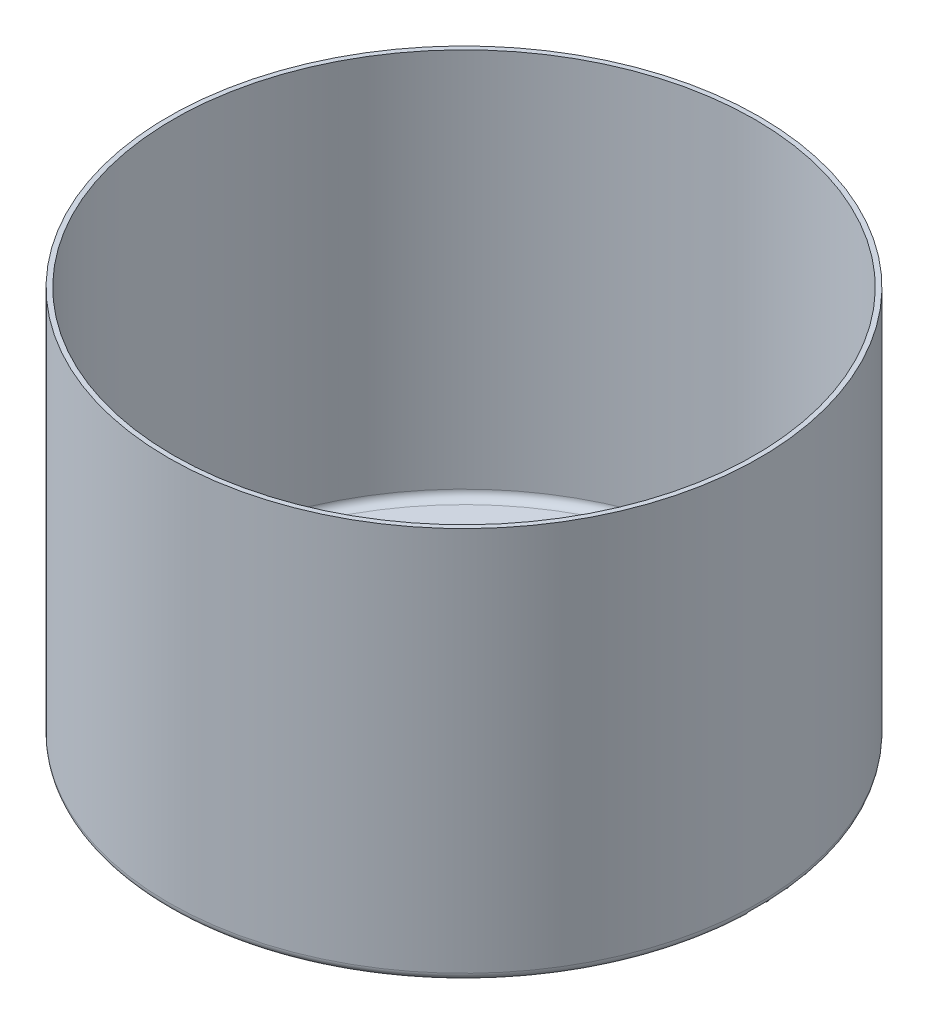
ISO-10303-21;
HEADER;
FILE_DESCRIPTION(('STEP AP214'),'2;1');
FILE_NAME('part.step','',(''),(''),'','','');
FILE_SCHEMA(('AUTOMOTIVE_DESIGN { 1 0 10303 214 1 1 1 1 }'));
ENDSEC;
DATA;
#1=APPLICATION_CONTEXT('core data for automotive mechanical design processes');
#2=APPLICATION_PROTOCOL_DEFINITION('international standard','automotive_design',2000,#1);
#3=PRODUCT_CONTEXT('',#1,'mechanical');
#4=PRODUCT('Part','Part','',(#3));
#5=PRODUCT_RELATED_PRODUCT_CATEGORY('part','',(#4));
#6=PRODUCT_DEFINITION_FORMATION('','',#4);
#7=PRODUCT_DEFINITION_CONTEXT('part definition',#1,'design');
#8=PRODUCT_DEFINITION('design','',#6,#7);
#9=PRODUCT_DEFINITION_SHAPE('','',#8);
#10=(LENGTH_UNIT() NAMED_UNIT(*) SI_UNIT(.MILLI.,.METRE.));
#11=(NAMED_UNIT(*) PLANE_ANGLE_UNIT() SI_UNIT($,.RADIAN.));
#12=(NAMED_UNIT(*) SI_UNIT($,.STERADIAN.) SOLID_ANGLE_UNIT());
#13=UNCERTAINTY_MEASURE_WITH_UNIT(LENGTH_MEASURE(1.E-05),#10,'distance_accuracy_value','');
#14=(GEOMETRIC_REPRESENTATION_CONTEXT(3) GLOBAL_UNCERTAINTY_ASSIGNED_CONTEXT((#13)) GLOBAL_UNIT_ASSIGNED_CONTEXT((#10,
#11,#12)) REPRESENTATION_CONTEXT('',''));
#15=CARTESIAN_POINT('',(0.,0.,0.));
#16=DIRECTION('',(0.,0.,1.));
#17=DIRECTION('',(1.,0.,0.));
#18=AXIS2_PLACEMENT_3D('',#15,#16,#17);
#19=CARTESIAN_POINT('',(93.98,-78.476,0.));
#20=DIRECTION('',(0.,1.,0.));
#21=DIRECTION('',(0.,0.,1.));
#22=AXIS2_PLACEMENT_3D('',#19,#20,#21);
#23=PLANE('',#22);
#24=CARTESIAN_POINT('',(0.,-78.476,0.));
#25=DIRECTION('',(0.,1.,0.));
#26=DIRECTION('',(0.,0.,1.));
#27=AXIS2_PLACEMENT_3D('',#24,#25,#26);
#28=CIRCLE('',#27,91.44);
#29=CARTESIAN_POINT('',(0.,-78.476,91.44));
#30=VERTEX_POINT('',#29);
#31=EDGE_CURVE('E48',#30,#30,#28,.T.);
#32=ORIENTED_EDGE('',*,*,#31,.T.);
#33=EDGE_LOOP('',(#32));
#34=FACE_BOUND('',#33,.T.);
#35=CARTESIAN_POINT('',(-63.5,-78.476,0.));
#36=DIRECTION('',(0.,1.,0.));
#37=DIRECTION('',(0.,0.,1.));
#38=AXIS2_PLACEMENT_3D('',#35,#36,#37);
#39=CIRCLE('',#38,3.25);
#40=CARTESIAN_POINT('',(-63.5,-78.476,3.25));
#41=VERTEX_POINT('',#40);
#42=EDGE_CURVE('E85',#41,#41,#39,.F.);
#43=ORIENTED_EDGE('',*,*,#42,.T.);
#44=EDGE_LOOP('',(#43));
#45=FACE_BOUND('',#44,.T.);
#46=CARTESIAN_POINT('',(0.,-78.476,-63.5));
#47=DIRECTION('',(0.,1.,0.));
#48=DIRECTION('',(0.,0.,1.));
#49=AXIS2_PLACEMENT_3D('',#46,#47,#48);
#50=CIRCLE('',#49,3.25);
#51=CARTESIAN_POINT('',(0.,-78.476,-60.25));
#52=VERTEX_POINT('',#51);
#53=EDGE_CURVE('E74',#52,#52,#50,.F.);
#54=ORIENTED_EDGE('',*,*,#53,.T.);
#55=EDGE_LOOP('',(#54));
#56=FACE_BOUND('',#55,.T.);
#57=CARTESIAN_POINT('',(63.5,-78.476,0.));
#58=DIRECTION('',(0.,1.,0.));
#59=DIRECTION('',(0.,0.,1.));
#60=AXIS2_PLACEMENT_3D('',#57,#58,#59);
#61=CIRCLE('',#60,3.25000000000001);
#62=CARTESIAN_POINT('',(63.5,-78.476,3.25000000000001));
#63=VERTEX_POINT('',#62);
#64=EDGE_CURVE('E73',#63,#63,#61,.F.);
#65=ORIENTED_EDGE('',*,*,#64,.T.);
#66=EDGE_LOOP('',(#65));
#67=FACE_BOUND('',#66,.T.);
#68=CARTESIAN_POINT('',(0.,-78.476,63.5));
#69=DIRECTION('',(0.,1.,0.));
#70=DIRECTION('',(0.,0.,1.));
#71=AXIS2_PLACEMENT_3D('',#68,#69,#70);
#72=CIRCLE('',#71,3.25);
#73=CARTESIAN_POINT('',(0.,-78.476,66.75));
#74=VERTEX_POINT('',#73);
#75=EDGE_CURVE('E67',#74,#74,#72,.F.);
#76=ORIENTED_EDGE('',*,*,#75,.T.);
#77=EDGE_LOOP('',(#76));
#78=FACE_BOUND('',#77,.T.);
#79=CARTESIAN_POINT('',(0.,-78.476,0.));
#80=DIRECTION('',(0.,1.,0.));
#81=DIRECTION('',(0.,0.,1.));
#82=AXIS2_PLACEMENT_3D('',#79,#80,#81);
#83=CIRCLE('',#82,18.415);
#84=CARTESIAN_POINT('',(0.,-78.476,18.415));
#85=VERTEX_POINT('',#84);
#86=EDGE_CURVE('E64',#85,#85,#83,.F.);
#87=ORIENTED_EDGE('',*,*,#86,.T.);
#88=EDGE_LOOP('',(#87));
#89=FACE_BOUND('',#88,.T.);
#90=ADVANCED_FACE('F37',(#34,#45,#56,#67,#78,#89),#23,.T.);
#91=CARTESIAN_POINT('',(0.,0.,0.));
#92=DIRECTION('',(0.,-1.,0.));
#93=DIRECTION('',(0.,0.,-1.));
#94=AXIS2_PLACEMENT_3D('',#91,#92,#93);
#95=CYLINDRICAL_SURFACE('',#94,95.504);
#96=CARTESIAN_POINT('',(0.,-77.46,0.));
#97=DIRECTION('',(0.,-1.,0.));
#98=DIRECTION('',(0.,0.,-1.));
#99=AXIS2_PLACEMENT_3D('',#96,#97,#98);
#100=CIRCLE('',#99,95.504);
#101=CARTESIAN_POINT('',(0.,-77.46,-95.504));
#102=VERTEX_POINT('',#101);
#103=EDGE_CURVE('E10',#102,#102,#100,.F.);
#104=ORIENTED_EDGE('',*,*,#103,.T.);
#105=EDGE_LOOP('',(#104));
#106=FACE_BOUND('',#105,.T.);
#107=CARTESIAN_POINT('',(0.,47.,0.));
#108=DIRECTION('',(0.,-1.,0.));
#109=DIRECTION('',(0.,0.,-1.));
#110=AXIS2_PLACEMENT_3D('',#107,#108,#109);
#111=CIRCLE('',#110,95.504);
#112=CARTESIAN_POINT('',(0.,47.,-95.504));
#113=VERTEX_POINT('',#112);
#114=EDGE_CURVE('E60',#113,#113,#111,.T.);
#115=ORIENTED_EDGE('',*,*,#114,.T.);
#116=EDGE_LOOP('',(#115));
#117=FACE_BOUND('',#116,.T.);
#118=ADVANCED_FACE('F108',(#106,#117),#95,.T.);
#119=CARTESIAN_POINT('',(95.504,-80.,0.));
#120=DIRECTION('',(0.,-1.,0.));
#121=DIRECTION('',(0.,0.,-1.));
#122=AXIS2_PLACEMENT_3D('',#119,#120,#121);
#123=PLANE('',#122);
#124=CARTESIAN_POINT('',(0.,-80.,0.));
#125=DIRECTION('',(0.,-1.,0.));
#126=DIRECTION('',(0.,0.,-1.));
#127=AXIS2_PLACEMENT_3D('',#124,#125,#126);
#128=CIRCLE('',#127,92.964);
#129=CARTESIAN_POINT('',(0.,-80.,-92.964));
#130=VERTEX_POINT('',#129);
#131=EDGE_CURVE('E44',#130,#130,#128,.T.);
#132=ORIENTED_EDGE('',*,*,#131,.T.);
#133=EDGE_LOOP('',(#132));
#134=FACE_BOUND('',#133,.T.);
#135=CARTESIAN_POINT('',(0.,-80.,63.5));
#136=DIRECTION('',(0.,-1.,0.));
#137=DIRECTION('',(0.,0.,-1.));
#138=AXIS2_PLACEMENT_3D('',#135,#136,#137);
#139=CIRCLE('',#138,3.25);
#140=CARTESIAN_POINT('',(0.,-80.,60.25));
#141=VERTEX_POINT('',#140);
#142=EDGE_CURVE('E77',#141,#141,#139,.T.);
#143=ORIENTED_EDGE('',*,*,#142,.F.);
#144=EDGE_LOOP('',(#143));
#145=FACE_BOUND('',#144,.T.);
#146=CARTESIAN_POINT('',(63.5,-80.,0.));
#147=DIRECTION('',(0.,-1.,0.));
#148=DIRECTION('',(0.,0.,-1.));
#149=AXIS2_PLACEMENT_3D('',#146,#147,#148);
#150=CIRCLE('',#149,3.25000000000001);
#151=CARTESIAN_POINT('',(63.5,-80.,-3.25000000000001));
#152=VERTEX_POINT('',#151);
#153=EDGE_CURVE('E70',#152,#152,#150,.T.);
#154=ORIENTED_EDGE('',*,*,#153,.F.);
#155=EDGE_LOOP('',(#154));
#156=FACE_BOUND('',#155,.T.);
#157=CARTESIAN_POINT('',(0.,-80.,-63.5));
#158=DIRECTION('',(0.,-1.,0.));
#159=DIRECTION('',(0.,0.,-1.));
#160=AXIS2_PLACEMENT_3D('',#157,#158,#159);
#161=CIRCLE('',#160,3.25);
#162=CARTESIAN_POINT('',(0.,-80.,-66.75));
#163=VERTEX_POINT('',#162);
#164=EDGE_CURVE('E88',#163,#163,#161,.T.);
#165=ORIENTED_EDGE('',*,*,#164,.F.);
#166=EDGE_LOOP('',(#165));
#167=FACE_BOUND('',#166,.T.);
#168=CARTESIAN_POINT('',(-63.5,-80.,0.));
#169=DIRECTION('',(0.,-1.,0.));
#170=DIRECTION('',(0.,0.,-1.));
#171=AXIS2_PLACEMENT_3D('',#168,#169,#170);
#172=CIRCLE('',#171,3.25);
#173=CARTESIAN_POINT('',(-63.5,-80.,-3.25));
#174=VERTEX_POINT('',#173);
#175=EDGE_CURVE('E82',#174,#174,#172,.T.);
#176=ORIENTED_EDGE('',*,*,#175,.F.);
#177=EDGE_LOOP('',(#176));
#178=FACE_BOUND('',#177,.T.);
#179=CARTESIAN_POINT('',(0.,-80.,0.));
#180=DIRECTION('',(0.,-1.,0.));
#181=DIRECTION('',(0.,0.,-1.));
#182=AXIS2_PLACEMENT_3D('',#179,#180,#181);
#183=CIRCLE('',#182,18.415);
#184=CARTESIAN_POINT('',(0.,-80.,-18.415));
#185=VERTEX_POINT('',#184);
#186=EDGE_CURVE('E63',#185,#185,#183,.T.);
#187=ORIENTED_EDGE('',*,*,#186,.F.);
#188=EDGE_LOOP('',(#187));
#189=FACE_BOUND('',#188,.T.);
#190=ADVANCED_FACE('F104',(#134,#145,#156,#167,#178,#189),#123,.T.);
#191=CARTESIAN_POINT('',(0.,0.,0.));
#192=DIRECTION('',(0.,-1.,0.));
#193=DIRECTION('',(0.,0.,-1.));
#194=AXIS2_PLACEMENT_3D('',#191,#192,#193);
#195=CYLINDRICAL_SURFACE('',#194,93.98);
#196=CARTESIAN_POINT('',(0.,-75.936,0.));
#197=DIRECTION('',(0.,1.,0.));
#198=DIRECTION('',(0.,0.,1.));
#199=AXIS2_PLACEMENT_3D('',#196,#197,#198);
#200=CIRCLE('',#199,93.98);
#201=CARTESIAN_POINT('',(0.,-75.936,93.98));
#202=VERTEX_POINT('',#201);
#203=EDGE_CURVE('E52',#202,#202,#200,.F.);
#204=ORIENTED_EDGE('',*,*,#203,.T.);
#205=EDGE_LOOP('',(#204));
#206=FACE_BOUND('',#205,.T.);
#207=CARTESIAN_POINT('',(0.,47.,0.));
#208=DIRECTION('',(0.,-1.,0.));
#209=DIRECTION('',(0.,0.,-1.));
#210=AXIS2_PLACEMENT_3D('',#207,#208,#209);
#211=CIRCLE('',#210,93.98);
#212=CARTESIAN_POINT('',(0.,47.,-93.98));
#213=VERTEX_POINT('',#212);
#214=EDGE_CURVE('E57',#213,#213,#211,.T.);
#215=ORIENTED_EDGE('',*,*,#214,.F.);
#216=EDGE_LOOP('',(#215));
#217=FACE_BOUND('',#216,.T.);
#218=ADVANCED_FACE('F107',(#206,#217),#195,.F.);
#219=CARTESIAN_POINT('',(93.98,47.,0.));
#220=DIRECTION('',(0.,1.,0.));
#221=DIRECTION('',(0.,0.,1.));
#222=AXIS2_PLACEMENT_3D('',#219,#220,#221);
#223=PLANE('',#222);
#224=ORIENTED_EDGE('',*,*,#214,.T.);
#225=EDGE_LOOP('',(#224));
#226=FACE_BOUND('',#225,.T.);
#227=ORIENTED_EDGE('',*,*,#114,.F.);
#228=EDGE_LOOP('',(#227));
#229=FACE_BOUND('',#228,.T.);
#230=ADVANCED_FACE('F140',(#226,#229),#223,.T.);
#231=CARTESIAN_POINT('',(-63.5,47.001,0.));
#232=DIRECTION('',(0.,-1.,0.));
#233=DIRECTION('',(0.,0.,-1.));
#234=AXIS2_PLACEMENT_3D('',#231,#232,#233);
#235=CYLINDRICAL_SURFACE('',#234,3.25);
#236=ORIENTED_EDGE('',*,*,#42,.F.);
#237=EDGE_LOOP('',(#236));
#238=FACE_BOUND('',#237,.T.);
#239=ORIENTED_EDGE('',*,*,#175,.T.);
#240=EDGE_LOOP('',(#239));
#241=FACE_BOUND('',#240,.T.);
#242=ADVANCED_FACE('F100',(#238,#241),#235,.F.);
#243=CARTESIAN_POINT('',(0.,47.001,-63.5));
#244=DIRECTION('',(0.,-1.,0.));
#245=DIRECTION('',(0.,0.,-1.));
#246=AXIS2_PLACEMENT_3D('',#243,#244,#245);
#247=CYLINDRICAL_SURFACE('',#246,3.25);
#248=ORIENTED_EDGE('',*,*,#53,.F.);
#249=EDGE_LOOP('',(#248));
#250=FACE_BOUND('',#249,.T.);
#251=ORIENTED_EDGE('',*,*,#164,.T.);
#252=EDGE_LOOP('',(#251));
#253=FACE_BOUND('',#252,.T.);
#254=ADVANCED_FACE('F96',(#250,#253),#247,.F.);
#255=CARTESIAN_POINT('',(63.5,47.001,0.));
#256=DIRECTION('',(0.,-1.,0.));
#257=DIRECTION('',(0.,0.,-1.));
#258=AXIS2_PLACEMENT_3D('',#255,#256,#257);
#259=CYLINDRICAL_SURFACE('',#258,3.25000000000001);
#260=ORIENTED_EDGE('',*,*,#64,.F.);
#261=EDGE_LOOP('',(#260));
#262=FACE_BOUND('',#261,.T.);
#263=ORIENTED_EDGE('',*,*,#153,.T.);
#264=EDGE_LOOP('',(#263));
#265=FACE_BOUND('',#264,.T.);
#266=ADVANCED_FACE('F99',(#262,#265),#259,.F.);
#267=CARTESIAN_POINT('',(0.,47.001,63.5));
#268=DIRECTION('',(0.,-1.,0.));
#269=DIRECTION('',(0.,0.,-1.));
#270=AXIS2_PLACEMENT_3D('',#267,#268,#269);
#271=CYLINDRICAL_SURFACE('',#270,3.25);
#272=ORIENTED_EDGE('',*,*,#75,.F.);
#273=EDGE_LOOP('',(#272));
#274=FACE_BOUND('',#273,.T.);
#275=ORIENTED_EDGE('',*,*,#142,.T.);
#276=EDGE_LOOP('',(#275));
#277=FACE_BOUND('',#276,.T.);
#278=ADVANCED_FACE('F117',(#274,#277),#271,.F.);
#279=CARTESIAN_POINT('',(0.,47.001,0.));
#280=DIRECTION('',(0.,-1.,0.));
#281=DIRECTION('',(0.,0.,-1.));
#282=AXIS2_PLACEMENT_3D('',#279,#280,#281);
#283=CYLINDRICAL_SURFACE('',#282,18.415);
#284=ORIENTED_EDGE('',*,*,#86,.F.);
#285=EDGE_LOOP('',(#284));
#286=FACE_BOUND('',#285,.T.);
#287=ORIENTED_EDGE('',*,*,#186,.T.);
#288=EDGE_LOOP('',(#287));
#289=FACE_BOUND('',#288,.T.);
#290=ADVANCED_FACE('F114',(#286,#289),#283,.F.);
#291=CARTESIAN_POINT('',(0.,-75.936,0.));
#292=DIRECTION('',(0.,1.,0.));
#293=DIRECTION('',(0.,0.,1.));
#294=AXIS2_PLACEMENT_3D('',#291,#292,#293);
#295=TOROIDAL_SURFACE('',#294,91.44,2.54);
#296=ORIENTED_EDGE('',*,*,#31,.F.);
#297=EDGE_LOOP('',(#296));
#298=FACE_BOUND('',#297,.T.);
#299=ORIENTED_EDGE('',*,*,#203,.F.);
#300=EDGE_LOOP('',(#299));
#301=FACE_BOUND('',#300,.T.);
#302=ADVANCED_FACE('F116',(#298,#301),#295,.F.);
#303=CARTESIAN_POINT('',(0.,-77.46,0.));
#304=DIRECTION('',(0.,-1.,0.));
#305=DIRECTION('',(0.,0.,-1.));
#306=AXIS2_PLACEMENT_3D('',#303,#304,#305);
#307=TOROIDAL_SURFACE('',#306,92.964,2.54);
#308=ORIENTED_EDGE('',*,*,#103,.F.);
#309=EDGE_LOOP('',(#308));
#310=FACE_BOUND('',#309,.T.);
#311=ORIENTED_EDGE('',*,*,#131,.F.);
#312=EDGE_LOOP('',(#311));
#313=FACE_BOUND('',#312,.T.);
#314=ADVANCED_FACE('F39',(#310,#313),#307,.T.);
#315=CLOSED_SHELL('',(#90,#118,#190,#218,#230,#242,#254,#266,#278,#290,#302,#314));
#316=MANIFOLD_SOLID_BREP('B2',#315);
#317=ADVANCED_BREP_SHAPE_REPRESENTATION('',(#18,#316),#14);
#318=SHAPE_DEFINITION_REPRESENTATION(#9,#317);
ENDSEC;
END-ISO-10303-21;
